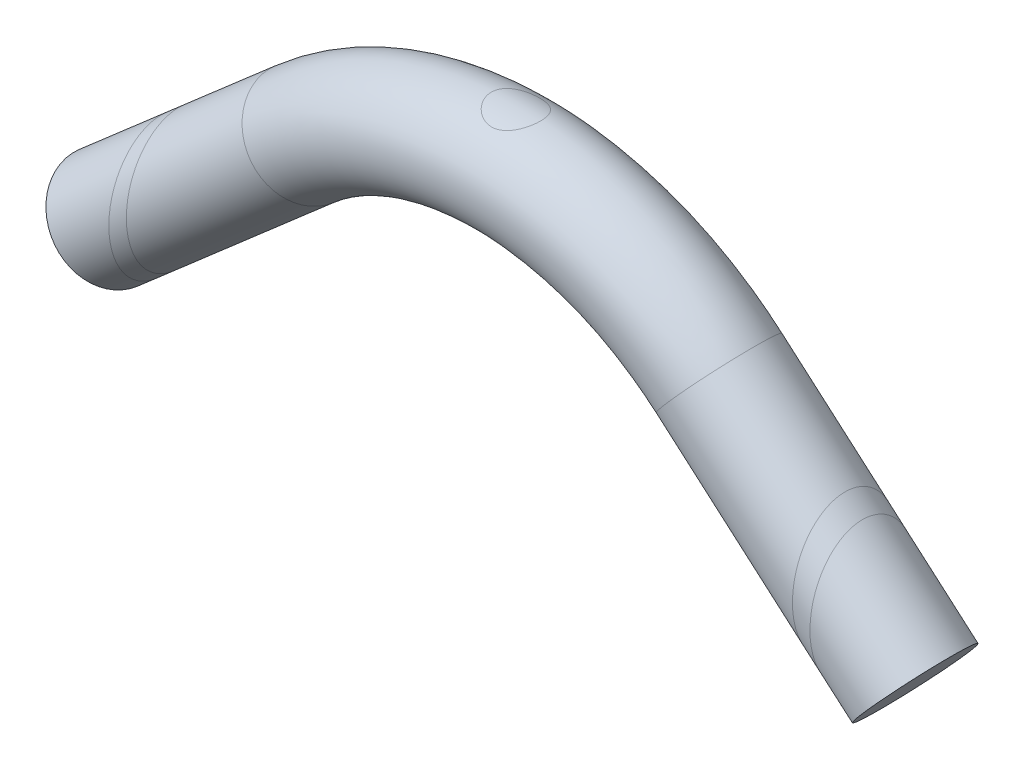
ISO-10303-21;
HEADER;
FILE_DESCRIPTION(('STEP AP214'),'2;1');
FILE_NAME('part.step','',(''),(''),'','','');
FILE_SCHEMA(('AUTOMOTIVE_DESIGN { 1 0 10303 214 1 1 1 1 }'));
ENDSEC;
DATA;
#1=APPLICATION_CONTEXT('core data for automotive mechanical design processes');
#2=APPLICATION_PROTOCOL_DEFINITION('international standard','automotive_design',2000,#1);
#3=PRODUCT_CONTEXT('',#1,'mechanical');
#4=PRODUCT('Part','Part','',(#3));
#5=PRODUCT_RELATED_PRODUCT_CATEGORY('part','',(#4));
#6=PRODUCT_DEFINITION_FORMATION('','',#4);
#7=PRODUCT_DEFINITION_CONTEXT('part definition',#1,'design');
#8=PRODUCT_DEFINITION('design','',#6,#7);
#9=PRODUCT_DEFINITION_SHAPE('','',#8);
#10=(LENGTH_UNIT() NAMED_UNIT(*) SI_UNIT(.MILLI.,.METRE.));
#11=(NAMED_UNIT(*) PLANE_ANGLE_UNIT() SI_UNIT($,.RADIAN.));
#12=(NAMED_UNIT(*) SI_UNIT($,.STERADIAN.) SOLID_ANGLE_UNIT());
#13=UNCERTAINTY_MEASURE_WITH_UNIT(LENGTH_MEASURE(1.E-05),#10,'distance_accuracy_value','');
#14=(GEOMETRIC_REPRESENTATION_CONTEXT(3) GLOBAL_UNCERTAINTY_ASSIGNED_CONTEXT((#13)) GLOBAL_UNIT_ASSIGNED_CONTEXT((#10,
#11,#12)) REPRESENTATION_CONTEXT('',''));
#15=CARTESIAN_POINT('',(0.,0.,0.));
#16=DIRECTION('',(0.,0.,1.));
#17=DIRECTION('',(1.,0.,0.));
#18=AXIS2_PLACEMENT_3D('',#15,#16,#17);
#19=CARTESIAN_POINT('',(174.056084343231,48.6468831797989,0.));
#20=DIRECTION('',(0.754605522163505,-0.656178714924787,0.));
#21=DIRECTION('',(0.656178714924787,0.754605522163505,0.));
#22=AXIS2_PLACEMENT_3D('',#19,#20,#21);
#23=CYLINDRICAL_SURFACE('',#22,15.);
#24=CARTESIAN_POINT('',(174.056084343231,48.6468831797989,0.));
#25=DIRECTION('',(0.754605522163501,-0.656178714924791,0.));
#26=DIRECTION('',(0.,0.,-1.));
#27=AXIS2_PLACEMENT_3D('',#24,#25,#26);
#28=CIRCLE('',#27,15.);
#29=CARTESIAN_POINT('',(174.056084343231,48.6468831797989,-15.));
#30=VERTEX_POINT('',#29);
#31=EDGE_CURVE('E112',#30,#30,#28,.T.);
#32=ORIENTED_EDGE('',*,*,#31,.T.);
#33=EDGE_LOOP('',(#32));
#34=FACE_BOUND('',#33,.T.);
#35=CARTESIAN_POINT('',(210.,17.3913043478261,0.));
#36=DIRECTION('',(1.,0.,0.));
#37=DIRECTION('',(0.,-1.,0.));
#38=AXIS2_PLACEMENT_3D('',#35,#36,#37);
#39=ELLIPSE('',#38,19.8779356358193,15.);
#40=CARTESIAN_POINT('',(210.,-2.48663128799323,0.));
#41=VERTEX_POINT('',#40);
#42=EDGE_CURVE('E10',#41,#41,#39,.F.);
#43=ORIENTED_EDGE('',*,*,#42,.T.);
#44=EDGE_LOOP('',(#43));
#45=FACE_BOUND('',#44,.T.);
#46=ADVANCED_FACE('F34',(#34,#45),#23,.T.);
#47=CARTESIAN_POINT('',(230.,0.,0.));
#48=DIRECTION('',(0.754605522163501,-0.656178714924791,0.));
#49=DIRECTION('',(0.,0.,-1.));
#50=AXIS2_PLACEMENT_3D('',#47,#48,#49);
#51=CIRCLE('',#50,15.);
#52=CARTESIAN_POINT('',(230.,0.,-15.));
#53=VERTEX_POINT('',#52);
#54=EDGE_CURVE('E114',#53,#53,#51,.T.);
#55=ORIENTED_EDGE('',*,*,#54,.F.);
#56=EDGE_LOOP('',(#55));
#57=FACE_BOUND('',#56,.T.);
#58=CARTESIAN_POINT('',(215.,13.0434782608696,0.));
#59=DIRECTION('',(-1.,0.,0.));
#60=DIRECTION('',(0.,-1.,0.));
#61=AXIS2_PLACEMENT_3D('',#58,#59,#60);
#62=ELLIPSE('',#61,19.8779356358194,15.);
#63=CARTESIAN_POINT('',(215.,-6.83445737494978,0.));
#64=VERTEX_POINT('',#63);
#65=EDGE_CURVE('E42',#64,#64,#62,.F.);
#66=ORIENTED_EDGE('',*,*,#65,.T.);
#67=EDGE_LOOP('',(#66));
#68=FACE_BOUND('',#67,.T.);
#69=ADVANCED_FACE('F98',(#57,#68),#23,.T.);
#70=CARTESIAN_POINT('',(55.9439156567688,48.6468831797989,0.));
#71=DIRECTION('',(-0.754605522163505,-0.656178714924787,0.));
#72=DIRECTION('',(0.656178714924787,-0.754605522163505,0.));
#73=AXIS2_PLACEMENT_3D('',#70,#71,#72);
#74=CYLINDRICAL_SURFACE('',#73,15.);
#75=CARTESIAN_POINT('',(20.,17.3913043478261,0.));
#76=DIRECTION('',(1.,0.,0.));
#77=DIRECTION('',(0.,-1.,0.));
#78=AXIS2_PLACEMENT_3D('',#75,#76,#77);
#79=ELLIPSE('',#78,19.8779356358193,15.);
#80=CARTESIAN_POINT('',(20.,-2.48663128799324,0.));
#81=VERTEX_POINT('',#80);
#82=EDGE_CURVE('E56',#81,#81,#79,.T.);
#83=ORIENTED_EDGE('',*,*,#82,.F.);
#84=EDGE_LOOP('',(#83));
#85=FACE_BOUND('',#84,.T.);
#86=CARTESIAN_POINT('',(15.,13.0434782608696,0.));
#87=DIRECTION('',(-1.,0.,0.));
#88=DIRECTION('',(0.,-1.,0.));
#89=AXIS2_PLACEMENT_3D('',#86,#87,#88);
#90=ELLIPSE('',#89,19.8779356358194,15.);
#91=CARTESIAN_POINT('',(15.,-6.83445737494979,0.));
#92=VERTEX_POINT('',#91);
#93=EDGE_CURVE('E49',#92,#92,#90,.T.);
#94=ORIENTED_EDGE('',*,*,#93,.F.);
#95=EDGE_LOOP('',(#94));
#96=FACE_BOUND('',#95,.T.);
#97=ADVANCED_FACE('F88',(#85,#96),#74,.T.);
#98=ORIENTED_EDGE('',*,*,#93,.T.);
#99=EDGE_LOOP('',(#98));
#100=FACE_BOUND('',#99,.T.);
#101=CARTESIAN_POINT('',(0.,0.,0.));
#102=DIRECTION('',(0.7546055221635,0.656178714924792,0.));
#103=DIRECTION('',(0.,0.,-1.));
#104=AXIS2_PLACEMENT_3D('',#101,#102,#103);
#105=CIRCLE('',#104,15.);
#106=CARTESIAN_POINT('',(0.,0.,-15.));
#107=VERTEX_POINT('',#106);
#108=EDGE_CURVE('E70',#107,#107,#105,.T.);
#109=ORIENTED_EDGE('',*,*,#108,.T.);
#110=EDGE_LOOP('',(#109));
#111=FACE_BOUND('',#110,.T.);
#112=ADVANCED_FACE('F89',(#100,#111),#74,.T.);
#113=CARTESIAN_POINT('',(115.,-19.2676138149161,0.));
#114=DIRECTION('',(0.,0.,-1.));
#115=DIRECTION('',(-1.,0.,0.));
#116=AXIS2_PLACEMENT_3D('',#113,#114,#115);
#117=TOROIDAL_SURFACE('',#116,90.,15.);
#118=CARTESIAN_POINT('',(110.588080153037,85.0106860922542,-4.2962066277505));
#119=CARTESIAN_POINT('',(110.710333370802,84.9688042737843,-4.4534690690307));
#120=CARTESIAN_POINT('',(110.839197371035,84.9257780592193,-4.60537547301822));
#121=CARTESIAN_POINT('',(111.1092662584,84.8385685155191,-4.89755901823602));
#122=CARTESIAN_POINT('',(111.250478951075,84.7943844670604,-5.03782869320342));
#123=CARTESIAN_POINT('',(111.544722648569,84.7059378756666,-5.30620513999618));
#124=CARTESIAN_POINT('',(111.697783390272,84.6616754268374,-5.43427938207064));
#125=CARTESIAN_POINT('',(112.014505516151,84.5744150263256,-5.67705037735854));
#126=CARTESIAN_POINT('',(112.1781667711,84.5314170592374,-5.7917472936023));
#127=CARTESIAN_POINT('',(112.515366098727,84.4478828490656,-6.00711752303018));
#128=CARTESIAN_POINT('',(112.688915873195,84.4073496450391,-6.10777371412001));
#129=CARTESIAN_POINT('',(113.044595434889,84.3300760783223,-6.29406440857466));
#130=CARTESIAN_POINT('',(113.226720619008,84.2933337138385,-6.37970685698598));
#131=CARTESIAN_POINT('',(113.598324847087,84.2248607838035,-6.53519724918478));
#132=CARTESIAN_POINT('',(113.787797448337,84.1931259458068,-6.60505867961943));
#133=CARTESIAN_POINT('',(114.172914955624,84.1357511855118,-6.72834766548335));
#134=CARTESIAN_POINT('',(114.36855940978,84.1101108181647,-6.78177642099294));
#135=CARTESIAN_POINT('',(114.755652334536,84.0668680557006,-6.8695575852939));
#136=CARTESIAN_POINT('',(114.946897046943,84.0489574207315,-6.90465638501284));
#137=CARTESIAN_POINT('',(115.332170430975,84.020196550908,-6.95885151039911));
#138=CARTESIAN_POINT('',(115.526199023221,84.0093461151455,-6.97794829143142));
#139=CARTESIAN_POINT('',(115.915391274496,83.9950818814304,-6.99987763591605));
#140=CARTESIAN_POINT('',(116.110554591912,83.9916659508422,-7.00271486390702));
#141=CARTESIAN_POINT('',(116.500417542304,83.9923464117247,-6.99207973530268));
#142=CARTESIAN_POINT('',(116.695117197268,83.9964424395744,-6.97860816815513));
#143=CARTESIAN_POINT('',(117.067728790116,84.0113360326328,-6.93714730416917));
#144=CARTESIAN_POINT('',(117.245794709894,84.0216021716241,-6.91033566265612));
#145=CARTESIAN_POINT('',(117.598975783804,84.0479765892532,-6.84317181756936));
#146=CARTESIAN_POINT('',(117.774089902676,84.0640868747138,-6.80281496305834));
#147=CARTESIAN_POINT('',(118.120129153532,84.1015870161339,-6.70895336512736));
#148=CARTESIAN_POINT('',(118.291055192349,84.1229757178679,-6.65545149612454));
#149=CARTESIAN_POINT('',(118.627805073403,84.1703534045374,-6.53573510631109));
#150=CARTESIAN_POINT('',(118.793626917288,84.1963441650056,-6.46951567806704));
#151=CARTESIAN_POINT('',(119.123873754301,84.2529417584928,-6.3228119698531));
#152=CARTESIAN_POINT('',(119.28812184553,84.2836597292608,-6.24197261588938));
#153=CARTESIAN_POINT('',(119.609366823573,84.3482341430492,-6.06795742131536));
#154=CARTESIAN_POINT('',(119.766361229131,84.3820916482703,-5.97477740088003));
#155=CARTESIAN_POINT('',(120.072280573781,84.4520067227481,-5.7766867816381));
#156=CARTESIAN_POINT('',(120.221204277575,84.4880646270118,-5.67177439456514));
#157=CARTESIAN_POINT('',(120.510238709914,84.5614402896209,-5.4508349929985));
#158=CARTESIAN_POINT('',(120.65034900969,84.5987581091255,-5.33480743844589));
#159=CARTESIAN_POINT('',(120.9322498906,84.6768284482927,-5.08223563876463));
#160=CARTESIAN_POINT('',(121.073224772209,84.7176102477644,-4.94478843472622));
#161=CARTESIAN_POINT('',(121.343156686449,84.798425291416,-4.65844140575154));
#162=CARTESIAN_POINT('',(121.472117314919,84.8384587566846,-4.50954503203698));
#163=CARTESIAN_POINT('',(121.71730888673,84.9167306671187,-4.20103378765223));
#164=CARTESIAN_POINT('',(121.833533091867,84.9549681560692,-4.04141331474065));
#165=CARTESIAN_POINT('',(122.052303357531,85.0285885811069,-3.71252862345495));
#166=CARTESIAN_POINT('',(122.154855044328,85.0639726889834,-3.54326841303101));
#167=CARTESIAN_POINT('',(122.346717327223,85.1313755875043,-3.19392038639429));
#168=CARTESIAN_POINT('',(122.435847230271,85.1633470099221,-3.01372402498222));
#169=CARTESIAN_POINT('',(122.598482421903,85.2225141655747,-2.64573895426173));
#170=CARTESIAN_POINT('',(122.671994054538,85.2497118370958,-2.45795336468779));
#171=CARTESIAN_POINT('',(122.802698746245,85.2985764546699,-2.07611951544548));
#172=CARTESIAN_POINT('',(122.859894848006,85.320244431878,-1.88207243100892));
#173=CARTESIAN_POINT('',(122.957367681183,85.3574319659421,-1.48919977748589));
#174=CARTESIAN_POINT('',(122.997645533564,85.3729519301478,-1.29037452591319));
#175=CARTESIAN_POINT('',(123.058913869096,85.3966527345453,-0.901706109966652));
#176=CARTESIAN_POINT('',(123.080923122626,85.4052205239438,-0.712046559922282));
#177=CARTESIAN_POINT('',(123.109372290643,85.4163072653736,-0.331389929648165));
#178=CARTESIAN_POINT('',(123.115812867672,85.4188264748088,-0.140392906682985));
#179=CARTESIAN_POINT('',(123.113056349095,85.4177499653922,0.241433878820464));
#180=CARTESIAN_POINT('',(123.10386215487,85.4141553810918,0.432263665818315));
#181=CARTESIAN_POINT('',(123.069940492403,85.4009480141408,0.81232491651545));
#182=CARTESIAN_POINT('',(123.045213214133,85.391335305093,1.00155639973363));
#183=CARTESIAN_POINT('',(122.981706914586,85.3668148227675,1.36992080717891));
#184=CARTESIAN_POINT('',(122.943492144028,85.3521200920466,1.54916566283535));
#185=CARTESIAN_POINT('',(122.853261599904,85.3177364835023,1.90371771504092));
#186=CARTESIAN_POINT('',(122.801241289798,85.2980459641415,2.07902359665502));
#187=CARTESIAN_POINT('',(122.683878514959,85.2541417479619,2.42447362828106));
#188=CARTESIAN_POINT('',(122.618539718023,85.2299292965981,2.59461918461446));
#189=CARTESIAN_POINT('',(122.475036647971,85.1775264790299,2.92884814521632));
#190=CARTESIAN_POINT('',(122.396867503848,85.1493346026189,3.09292921802148));
#191=CARTESIAN_POINT('',(122.225485014265,85.0886207978344,3.41941645051938));
#192=CARTESIAN_POINT('',(122.131856266044,85.0559856633698,3.58158346009102));
#193=CARTESIAN_POINT('',(121.932185885003,84.9879273628851,3.89754163667667));
#194=CARTESIAN_POINT('',(121.826139987575,84.9525032403774,4.05132989932328));
#195=CARTESIAN_POINT('',(121.602331203223,84.8797145505011,4.34968686838114));
#196=CARTESIAN_POINT('',(121.484566014176,84.8423496025711,4.49425375416813));
#197=CARTESIAN_POINT('',(121.238034147643,84.7665831011805,4.77339229034065));
#198=CARTESIAN_POINT('',(121.109267040012,84.7281815072299,4.90796354953866));
#199=CARTESIAN_POINT('',(120.83296549764,84.6488510823205,5.17458545109663));
#200=CARTESIAN_POINT('',(120.68475926227,84.6079159453474,5.30593902725085));
#201=CARTESIAN_POINT('',(120.377627606019,84.5271266400189,5.55570944600869));
#202=CARTESIAN_POINT('',(120.218705653631,84.4872721276848,5.67413044246271));
#203=CARTESIAN_POINT('',(119.89091851249,84.4098115802084,5.89736247324602));
#204=CARTESIAN_POINT('',(119.722048040828,84.3722067614634,6.00216618003143));
#205=CARTESIAN_POINT('',(119.375507637768,84.3004965381697,6.19726639330381));
#206=CARTESIAN_POINT('',(119.197841599385,84.2663896055912,6.28756924423712));
#207=CARTESIAN_POINT('',(118.834269568391,84.2027551109962,6.45317700387719));
#208=CARTESIAN_POINT('',(118.648343103257,84.1732398484052,6.5284417791101));
#209=CARTESIAN_POINT('',(118.270045462923,84.1200229119304,6.6629125089341));
#210=CARTESIAN_POINT('',(118.077677190635,84.0963186584229,6.72212559043436));
#211=CARTESIAN_POINT('',(117.687969778928,84.0556852747822,6.82386208781551));
#212=CARTESIAN_POINT('',(117.490633156485,84.0387527846583,6.86639378040877));
#213=CARTESIAN_POINT('',(117.092538078232,84.01239764525,6.93429383785227));
#214=CARTESIAN_POINT('',(116.891779933409,84.0029743171255,6.95966375412261));
#215=CARTESIAN_POINT('',(116.504768948846,83.9925301845096,6.99159556826833));
#216=CARTESIAN_POINT('',(116.318642233454,83.990896824193,6.99950115884557));
#217=CARTESIAN_POINT('',(115.94641886261,83.9944771481832,7.00045299850533));
#218=CARTESIAN_POINT('',(115.760322206343,83.9996905959763,6.99349976086059));
#219=CARTESIAN_POINT('',(115.389592400176,84.0168226221296,6.96483359219984));
#220=CARTESIAN_POINT('',(115.204959200379,84.0287409708789,6.94312116661015));
#221=CARTESIAN_POINT('',(114.838509730042,84.0589036105019,6.88519875181672));
#222=CARTESIAN_POINT('',(114.656693478643,84.0771479443441,6.84898866413869));
#223=CARTESIAN_POINT('',(114.3028996378,84.1187028280134,6.76385396128808));
#224=CARTESIAN_POINT('',(114.130793423706,84.1418324635609,6.7153735630145));
#225=CARTESIAN_POINT('',(113.791370715898,84.1928110794241,6.60563055134465));
#226=CARTESIAN_POINT('',(113.624055802481,84.2206615963224,6.54436377465014));
#227=CARTESIAN_POINT('',(113.295192422658,84.2803103376349,6.40955658898653));
#228=CARTESIAN_POINT('',(113.133643359528,84.3121081519977,6.3360174546161));
#229=CARTESIAN_POINT('',(112.817077814765,84.3788300563019,6.17718672134496));
#230=CARTESIAN_POINT('',(112.66206372923,84.4137552785163,6.09189085986355));
#231=CARTESIAN_POINT('',(112.185889551197,84.527199870655,5.80590071543633));
#232=CARTESIAN_POINT('',(111.877636388994,84.6098627364902,5.58486502024433));
#233=CARTESIAN_POINT('',(111.300992664287,84.7771921779112,5.09626568169539));
#234=CARTESIAN_POINT('',(111.032618901987,84.8618595806439,4.82868253150557));
#235=CARTESIAN_POINT('',(110.656758959061,84.9868457062657,4.38774965636404));
#236=CARTESIAN_POINT('',(110.532732668831,85.0293850870082,4.22886253040263));
#237=CARTESIAN_POINT('',(110.298553181085,85.1116147768516,3.90051516276549));
#238=CARTESIAN_POINT('',(110.188394688551,85.1513061708697,3.73105899375852));
#239=CARTESIAN_POINT('',(109.982792722496,85.2267917595245,3.38255586542018));
#240=CARTESIAN_POINT('',(109.887353326724,85.2625848733857,3.20350626679009));
#241=CARTESIAN_POINT('',(109.712122653994,85.3292764202803,2.83712420281949));
#242=CARTESIAN_POINT('',(109.632323913399,85.3601771865553,2.64979574066493));
#243=CARTESIAN_POINT('',(109.491432438313,85.4153422487658,2.27427805383052));
#244=CARTESIAN_POINT('',(109.429820553541,85.4397880476273,2.08631035208692));
#245=CARTESIAN_POINT('',(109.322620925367,85.4826476401047,1.70526817229623));
#246=CARTESIAN_POINT('',(109.277026147471,85.5010640814895,1.51219597623475));
#247=CARTESIAN_POINT('',(109.202346170299,85.531371267952,1.12244027245747));
#248=CARTESIAN_POINT('',(109.173255718276,85.5432640892284,0.925757934319541));
#249=CARTESIAN_POINT('',(109.131906519475,85.5602014132011,0.53034304298823));
#250=CARTESIAN_POINT('',(109.119646770423,85.5652463236921,0.331610612588547));
#251=CARTESIAN_POINT('',(109.112361814033,85.5682422788509,-0.0525573048315527));
#252=CARTESIAN_POINT('',(109.116211079731,85.5666566049037,-0.237968898069775));
#253=CARTESIAN_POINT('',(109.138590540779,85.5574650745516,-0.607752204338709));
#254=CARTESIAN_POINT('',(109.157120438002,85.5498593403987,-0.792123938409721));
#255=CARTESIAN_POINT('',(109.208680654315,85.5288071406463,-1.15857657709778));
#256=CARTESIAN_POINT('',(109.241717935168,85.5153578709,-1.3406563386441));
#257=CARTESIAN_POINT('',(109.321961668142,85.4829410774606,-1.70115684484258));
#258=CARTESIAN_POINT('',(109.369167841579,85.4639736623023,-1.87957766138766));
#259=CARTESIAN_POINT('',(109.476837752284,85.4211512839357,-2.23007003319368));
#260=CARTESIAN_POINT('',(109.537184642564,85.397339512107,-2.40218284193045));
#261=CARTESIAN_POINT('',(109.670873923034,85.345256981579,-2.74067575201019));
#262=CARTESIAN_POINT('',(109.744222242161,85.3169841892056,-2.9070531963787));
#263=CARTESIAN_POINT('',(109.903134541232,85.2566806089604,-3.23268376002478));
#264=CARTESIAN_POINT('',(109.988671643189,85.2246581166929,-3.3919515682039));
#265=CARTESIAN_POINT('',(110.171469688416,85.157496779529,-3.70290615147262));
#266=CARTESIAN_POINT('',(110.268728505616,85.1223585000749,-3.85459429431335));
#267=CARTESIAN_POINT('',(110.406347255765,85.0737364254853,-4.05208266311589));
#268=CARTESIAN_POINT('',(110.441822844075,85.0612916986711,-4.10159895159401));
#269=CARTESIAN_POINT('',(110.514020189777,85.0361622485383,-4.1996455192194));
#270=CARTESIAN_POINT('',(110.550741844408,85.0234775450483,-4.248175879149));
#271=CARTESIAN_POINT('',(110.588080153037,85.0106860922542,-4.2962066277505));
#272=B_SPLINE_CURVE_WITH_KNOTS('',3,(#118,#119,#120,#121,#122,#123,#124,#125,#126,#127,#128,
#129,#130,#131,#132,#133,#134,#135,#136,#137,#138,#139,#140,#141,#142,#143,#144,#145,#146,#147,
#148,#149,#150,#151,#152,#153,#154,#155,#156,#157,#158,#159,#160,#161,#162,#163,#164,#165,#166,
#167,#168,#169,#170,#171,#172,#173,#174,#175,#176,#177,#178,#179,#180,#181,#182,#183,#184,#185,
#186,#187,#188,#189,#190,#191,#192,#193,#194,#195,#196,#197,#198,#199,#200,#201,#202,#203,#204,
#205,#206,#207,#208,#209,#210,#211,#212,#213,#214,#215,#216,#217,#218,#219,#220,#221,#222,#223,
#224,#225,#226,#227,#228,#229,#230,#231,#232,#233,#234,#235,#236,#237,#238,#239,#240,#241,#242,
#243,#244,#245,#246,#247,#248,#249,#250,#251,#252,#253,#254,#255,#256,#257,#258,#259,#260,#261,
#262,#263,#264,#265,#266,#267,#268,#269,#270,#271),.UNSPECIFIED.,.T.,.F.,(4,2,2,2,2,2,2,2,2,2,2,
2,2,2,2,2,2,2,2,2,2,2,2,2,2,2,2,2,2,2,2,2,2,2,2,2,2,2,2,2,2,2,2,2,2,2,2,2,2,2,2,2,2,2,2,2,2,2,2,
2,2,2,2,2,2,2,2,2,2,2,2,2,2,2,2,2,4),(0.,0.610583154258999,1.22155508387627,1.83411354908098,
2.44666454821633,3.05995611756356,3.67292215608763,4.28536234774131,4.89775780218489,
5.4827606047,6.06774675938806,6.65256508491316,7.23735510270296,7.77782479478306,
8.31848025482477,8.85901759492557,9.39976393741608,9.9560409169922,10.5125067936111,
11.0690576035641,11.6256354686938,12.2281490998513,12.8304818168144,13.433131674907,
14.0355327707213,14.6454316891759,15.2550823945687,15.8646193315388,16.4741158755875,
17.0467669865314,17.6193937272455,18.1919142158294,18.7644277025078,19.3153806197387,
19.8665148063945,20.4174974199651,20.9686896985028,21.5382990279597,22.1081045639122,
22.678022253517,23.2479622356057,23.8539298161883,24.4597021883869,25.0657991920599,
25.6716302880339,26.2790572361728,26.8862140449935,27.49306922193,28.0998695319825,
28.6580674392732,29.216246064887,29.7744055767147,30.3325688798632,30.8728608248962,
31.4133289664783,31.9537410103037,32.4943495066914,33.6537163615298,34.8135702526524,
35.4309340716962,36.0480614485684,36.6653594871847,37.2823622334899,37.879517706626,
38.4764105883977,39.0731133934439,39.6697806631347,40.2254808277781,40.7811697078659,
41.3371255422854,41.8930704425,42.4442602774599,42.9957021167478,43.5459462444301,
44.0960907192746,44.2825890249726,44.4690719877435),.UNSPECIFIED.);
#273=CARTESIAN_POINT('',(110.588080153037,85.0106860922542,-4.2962066277505));
#274=VERTEX_POINT('',#273);
#275=EDGE_CURVE('E63',#274,#274,#272,.T.);
#276=ORIENTED_EDGE('',*,*,#275,.T.);
#277=EDGE_LOOP('',(#276));
#278=FACE_BOUND('',#277,.T.);
#279=CARTESIAN_POINT('',(55.9439156567688,48.6468831797989,0.));
#280=DIRECTION('',(0.7546055221635,0.656178714924792,0.));
#281=DIRECTION('',(0.,0.,-1.));
#282=AXIS2_PLACEMENT_3D('',#279,#280,#281);
#283=CIRCLE('',#282,15.);
#284=CARTESIAN_POINT('',(55.9439156567688,48.6468831797989,-15.));
#285=VERTEX_POINT('',#284);
#286=EDGE_CURVE('E116',#285,#285,#283,.T.);
#287=ORIENTED_EDGE('',*,*,#286,.T.);
#288=EDGE_LOOP('',(#287));
#289=FACE_BOUND('',#288,.T.);
#290=ORIENTED_EDGE('',*,*,#31,.F.);
#291=EDGE_LOOP('',(#290));
#292=FACE_BOUND('',#291,.T.);
#293=CARTESIAN_POINT('',(109.933391254338,55.9260523832273,-3.28518633884096));
#294=CARTESIAN_POINT('',(109.850554926002,55.885405402096,-3.12933368514236));
#295=CARTESIAN_POINT('',(109.773418214975,55.8468356871537,-2.96996870099587));
#296=CARTESIAN_POINT('',(109.631107156614,55.7747094830647,-2.64490910331585));
#297=CARTESIAN_POINT('',(109.565928902859,55.7411513574717,-2.47921657821852));
#298=CARTESIAN_POINT('',(109.448105513525,55.6798497887927,-2.14230960341092));
#299=CARTESIAN_POINT('',(109.395465288062,55.6521086242396,-1.97109302008707));
#300=CARTESIAN_POINT('',(109.30331881756,55.6031764525475,-1.62431099541703));
#301=CARTESIAN_POINT('',(109.26380711382,55.5819827233118,-1.44874739422411));
#302=CARTESIAN_POINT('',(109.19823362242,55.5466375365953,-1.09376995621378));
#303=CARTESIAN_POINT('',(109.172219974742,55.5325112911819,-0.914344683553706));
#304=CARTESIAN_POINT('',(109.134183667741,55.5118103120392,-0.553578792316565));
#305=CARTESIAN_POINT('',(109.122161095748,55.5052356254452,-0.372238161791371));
#306=CARTESIAN_POINT('',(109.112266917108,55.4998269696694,-0.0090883409304081));
#307=CARTESIAN_POINT('',(109.114392727907,55.5009915878048,0.172720757838162));
#308=CARTESIAN_POINT('',(109.132761240932,55.5110249627403,0.535405302012874));
#309=CARTESIAN_POINT('',(109.149003552284,55.5198935062252,0.716280773130885));
#310=CARTESIAN_POINT('',(109.194351999909,55.5445161565612,1.06766132226524));
#311=CARTESIAN_POINT('',(109.222850207741,55.5599445108563,1.23826836408292));
#312=CARTESIAN_POINT('',(109.292221302295,55.5972131994188,1.57629228208433));
#313=CARTESIAN_POINT('',(109.333098528034,55.6190557818796,1.74370801776504));
#314=CARTESIAN_POINT('',(109.42678661095,55.6686122825542,2.07422933291182));
#315=CARTESIAN_POINT('',(109.479595019406,55.6963249959263,2.23733578914069));
#316=CARTESIAN_POINT('',(109.596671972321,55.7569884247127,2.55843976175653));
#317=CARTESIAN_POINT('',(109.660945005777,55.7899411913306,2.71643524820182));
#318=CARTESIAN_POINT('',(109.803620201269,55.8619713090125,3.03363393056508));
#319=CARTESIAN_POINT('',(109.882536653307,55.9012607953367,3.19255779146102));
#320=CARTESIAN_POINT('',(110.051700006,55.9838618087907,3.50319043985705));
#321=CARTESIAN_POINT('',(110.141950753704,56.0271747002257,3.65489675338061));
#322=CARTESIAN_POINT('',(110.428795725838,56.1617269021387,4.09820480372602));
#323=CARTESIAN_POINT('',(110.64154113551,56.2576102479595,4.37812457475948));
#324=CARTESIAN_POINT('',(111.132614892154,56.4651011084693,4.93278331210469));
#325=CARTESIAN_POINT('',(111.415692452066,56.5772406818364,5.20313606118373));
#326=CARTESIAN_POINT('',(111.871962982569,56.7405613396114,5.5711918797224));
#327=CARTESIAN_POINT('',(112.029453625249,56.794223630953,5.68770192899172));
#328=CARTESIAN_POINT('',(112.354438310901,56.8984238727423,5.90758204454914));
#329=CARTESIAN_POINT('',(112.521933809658,56.9489613663194,6.01095019170785));
#330=CARTESIAN_POINT('',(112.872765134174,57.0472016072538,6.20744543682728));
#331=CARTESIAN_POINT('',(113.056463404467,57.094718298911,6.30001960434356));
#332=CARTESIAN_POINT('',(113.432595008502,57.1829107833407,6.46909885026798));
#333=CARTESIAN_POINT('',(113.625023697788,57.2235901605098,6.54561235359402));
#334=CARTESIAN_POINT('',(114.017158909609,57.2964360908466,6.68159298468269));
#335=CARTESIAN_POINT('',(114.216857429527,57.3286117007114,6.74107825354513));
#336=CARTESIAN_POINT('',(114.622039304866,57.3830352709583,6.84220611840026));
#337=CARTESIAN_POINT('',(114.827521555294,57.4052851141753,6.88385209829713));
#338=CARTESIAN_POINT('',(115.217354273426,57.4367328354587,6.94471296377342));
#339=CARTESIAN_POINT('',(115.401279904485,57.4471770181733,6.96602063091498));
#340=CARTESIAN_POINT('',(115.770527922844,57.4590600727176,6.99398833156427));
#341=CARTESIAN_POINT('',(115.955850188481,57.460499720072,7.00064962647377));
#342=CARTESIAN_POINT('',(116.326238840949,57.4542531481262,6.99925059921114));
#343=CARTESIAN_POINT('',(116.51130527646,57.4465690080589,6.99119363097977));
#344=CARTESIAN_POINT('',(116.87963072235,57.4223125797845,6.96052483273872));
#345=CARTESIAN_POINT('',(117.062889778305,57.4057405162938,6.93791337071249));
#346=CARTESIAN_POINT('',(117.40965439089,57.3661480958896,6.88119790964346));
#347=CARTESIAN_POINT('',(117.573445024415,57.3438482182855,6.84832112421899));
#348=CARTESIAN_POINT('',(117.897363384952,57.2929767158562,6.77123078919048));
#349=CARTESIAN_POINT('',(118.057489883964,57.2644030214518,6.72701349781942));
#350=CARTESIAN_POINT('',(118.530994857264,57.1703626694853,6.5780281926156));
#351=CARTESIAN_POINT('',(118.837722535086,57.09654962527,6.45688942380725));
#352=CARTESIAN_POINT('',(119.453484947097,56.9264219260193,6.16267158573632));
#353=CARTESIAN_POINT('',(119.760383871534,56.8287055144302,5.98598162919719));
#354=CARTESIAN_POINT('',(120.342251891883,56.6241435787289,5.59026743280804));
#355=CARTESIAN_POINT('',(120.617198539697,56.5172917268931,5.37121371468464));
#356=CARTESIAN_POINT('',(121.167239162233,56.2882922273435,4.86110788289713));
#357=CARTESIAN_POINT('',(121.43702584735,56.1660858830036,4.56427808080865));
#358=CARTESIAN_POINT('',(121.801980342056,55.9919702789259,4.08586020586252));
#359=CARTESIAN_POINT('',(121.917064358628,55.9354349059724,3.92075668106545));
#360=CARTESIAN_POINT('',(122.13321618802,55.8268803090733,3.58010025112732));
#361=CARTESIAN_POINT('',(122.234282544038,55.7748615547321,3.40454626261528));
#362=CARTESIAN_POINT('',(122.421895924091,55.6765783148253,3.04301517466002));
#363=CARTESIAN_POINT('',(122.508361124457,55.6303466102296,2.85698665186399));
#364=CARTESIAN_POINT('',(122.665069104737,55.5454021615802,2.47665936449795));
#365=CARTESIAN_POINT('',(122.735320574381,55.5066853916834,2.28236509638579));
#366=CARTESIAN_POINT('',(122.858640280988,55.4380433076997,1.88705594256089));
#367=CARTESIAN_POINT('',(122.911722904177,55.4081106351473,1.68604684003719));
#368=CARTESIAN_POINT('',(122.999939992876,55.3580485298426,1.27893799404978));
#369=CARTESIAN_POINT('',(123.035077441398,55.337917467803,1.07283910263248));
#370=CARTESIAN_POINT('',(123.083559449586,55.3100574165093,0.6836250629273));
#371=CARTESIAN_POINT('',(123.099083380232,55.3010902899938,0.500866668580504));
#372=CARTESIAN_POINT('',(123.115726245529,55.2914748283552,0.134483551658487));
#373=CARTESIAN_POINT('',(123.116846513387,55.2908257233135,-0.0491410891627479));
#374=CARTESIAN_POINT('',(123.104667771456,55.2978648883821,-0.415711481983137));
#375=CARTESIAN_POINT('',(123.091371530919,55.3055515572819,-0.598657357593258));
#376=CARTESIAN_POINT('',(123.050555450501,55.329033282948,-0.962422240880587));
#377=CARTESIAN_POINT('',(123.02303577438,55.3448282463599,-1.1432412730206));
#378=CARTESIAN_POINT('',(122.956437622442,55.3827706767016,-1.48944929056385));
#379=CARTESIAN_POINT('',(122.918249851723,55.4044256606709,-1.65506455105893));
#380=CARTESIAN_POINT('',(122.830226858101,55.4538864994621,-1.98225207137916));
#381=CARTESIAN_POINT('',(122.780387711522,55.4816944261584,-2.14382294889529));
#382=CARTESIAN_POINT('',(122.614127547524,55.5734192797068,-2.62099858332312));
#383=CARTESIAN_POINT('',(122.480912754841,55.6456673729504,-2.92932741235546));
#384=CARTESIAN_POINT('',(122.16266660692,55.8123722420983,-3.54250955652881));
#385=CARTESIAN_POINT('',(121.974502494707,55.90808679013,-3.84537433507285));
#386=CARTESIAN_POINT('',(121.556607650105,56.1100774462298,-4.41704614376227));
#387=CARTESIAN_POINT('',(121.326848961755,56.2163606357573,-4.68583006009616));
#388=CARTESIAN_POINT('',(120.798507260962,56.4445796243657,-5.21713390179304));
#389=CARTESIAN_POINT('',(120.494899909488,56.5668001748412,-5.47459651661765));
#390=CARTESIAN_POINT('',(120.008454041581,56.7424748965096,-5.82045871173079));
#391=CARTESIAN_POINT('',(119.841013179374,56.7997921198351,-5.92908201304899));
#392=CARTESIAN_POINT('',(119.496356476464,56.9102842175264,-6.13219508328189));
#393=CARTESIAN_POINT('',(119.319139388101,56.9634585610718,-6.22668304248023));
#394=CARTESIAN_POINT('',(118.952475130866,57.064925459351,-6.40223813799449));
#395=CARTESIAN_POINT('',(118.762861161382,57.1131080452517,-6.48302105405458));
#396=CARTESIAN_POINT('',(118.375727676036,57.2016966608196,-6.62797561002581));
#397=CARTESIAN_POINT('',(118.178212656977,57.242107039984,-6.69215654774554));
#398=CARTESIAN_POINT('',(117.77690577097,57.3135602503606,-6.80294567859223));
#399=CARTESIAN_POINT('',(117.573121790693,57.3446143605783,-6.84957504723146));
#400=CARTESIAN_POINT('',(117.160904345527,57.3961027948979,-6.9245316590524));
#401=CARTESIAN_POINT('',(116.952471831291,57.4165392699745,-6.95286260950414));
#402=CARTESIAN_POINT('',(116.561845560042,57.4438989940701,-6.98806225899943));
#403=CARTESIAN_POINT('',(116.379967406503,57.4522895323224,-6.99733876296101));
#404=CARTESIAN_POINT('',(116.01585647301,57.4602593432555,-7.00167005053253));
#405=CARTESIAN_POINT('',(115.833623730097,57.4598394915904,-6.99672624752428));
#406=CARTESIAN_POINT('',(115.470348595596,57.4502660965152,-6.97266497515801));
#407=CARTESIAN_POINT('',(115.289306113148,57.4411132277279,-6.95354860065233));
#408=CARTESIAN_POINT('',(114.929866608705,57.4144750371725,-6.90140193361878));
#409=CARTESIAN_POINT('',(114.751469576131,57.3969897487358,-6.86837169674943));
#410=CARTESIAN_POINT('',(114.411640642494,57.3559320326195,-6.79175506002751));
#411=CARTESIAN_POINT('',(114.249926300815,57.332902170955,-6.74912422432795));
#412=CARTESIAN_POINT('',(113.93079648891,57.2809746753626,-6.65272483869331));
#413=CARTESIAN_POINT('',(113.77338247632,57.2520750791556,-6.59895256400287));
#414=CARTESIAN_POINT('',(113.308815261268,57.1577552359955,-6.4216209738825));
#415=CARTESIAN_POINT('',(113.009179568954,57.084693666089,-6.28201092957208));
#416=CARTESIAN_POINT('',(112.405896631726,56.9171793623188,-5.94780617660471));
#417=CARTESIAN_POINT('',(112.104980421529,56.821302289469,-5.74904499726975));
#418=CARTESIAN_POINT('',(111.538416910951,56.6230240025249,-5.30913801368193));
#419=CARTESIAN_POINT('',(111.272766657692,56.520623335726,-5.06799576200192));
#420=CARTESIAN_POINT('',(110.81267729311,56.3314986881857,-4.58113048321395));
#421=CARTESIAN_POINT('',(110.613472825172,56.2444556876619,-4.34000639245879));
#422=CARTESIAN_POINT('',(110.247901594051,56.0780784940398,-3.83139325801679));
#423=CARTESIAN_POINT('',(110.08153211521,55.9987436637032,-3.56390639744275));
#424=CARTESIAN_POINT('',(109.933391254338,55.9260523832273,-3.28518633884096));
#425=B_SPLINE_CURVE_WITH_KNOTS('',3,(#293,#294,#295,#296,#297,#298,#299,#300,#301,#302,#303,
#304,#305,#306,#307,#308,#309,#310,#311,#312,#313,#314,#315,#316,#317,#318,#319,#320,#321,#322,
#323,#324,#325,#326,#327,#328,#329,#330,#331,#332,#333,#334,#335,#336,#337,#338,#339,#340,#341,
#342,#343,#344,#345,#346,#347,#348,#349,#350,#351,#352,#353,#354,#355,#356,#357,#358,#359,#360,
#361,#362,#363,#364,#365,#366,#367,#368,#369,#370,#371,#372,#373,#374,#375,#376,#377,#378,#379,
#380,#381,#382,#383,#384,#385,#386,#387,#388,#389,#390,#391,#392,#393,#394,#395,#396,#397,#398,
#399,#400,#401,#402,#403,#404,#405,#406,#407,#408,#409,#410,#411,#412,#413,#414,#415,#416,#417,
#418,#419,#420,#421,#422,#423,#424),.UNSPECIFIED.,.T.,.F.,(4,2,2,2,2,2,2,2,2,2,2,2,2,2,2,2,2,2,
2,2,2,2,2,2,2,2,2,2,2,2,2,2,2,2,2,2,2,2,2,2,2,2,2,2,2,2,2,2,2,2,2,2,2,2,2,2,2,2,2,2,2,2,2,2,2,
4),(0.,0.543124865260171,1.08607199306228,1.62923140033289,2.17216468419189,2.7170212226301,
3.26188116192831,3.80664164874186,4.35138705207688,4.87176476164114,5.39232508226518,
5.91277866146226,6.43343647448725,6.97806685003175,7.52288258434156,8.61208418065553,
9.82792244238956,10.4367184912157,11.045603341468,11.6781116966883,12.3102874241903,
12.9417871326304,13.5731669998688,14.1287430781859,14.6842713062849,15.2396729585555,
15.7950605690746,16.3001162847317,16.8053388569201,17.8151062950591,18.913017665634,
20.0116957703631,21.2633135386563,21.8898263782065,22.5164042801188,23.1463846510256,
23.7760265965397,24.4051395734663,25.0341479394224,25.5843230008326,26.1344471374947,
26.6844656200733,27.2344777701782,27.7479016072992,28.2614985929476,29.2878984956678,
30.3911445954324,31.4951349650268,32.7382405666514,33.3606085361359,33.9830561179399,
34.6171511556078,35.2508903006575,35.8838623863416,36.5167061912572,37.0628864184232,
37.6090123616326,38.1550961201917,38.7011776943159,39.2070780394377,39.7131477885562,
40.7248046157683,41.8400535100971,42.9552089637769,43.9265900537336,44.8978907706669),.UNSPECIFIED.);
#426=CARTESIAN_POINT('',(109.933391254338,55.9260523832273,-3.28518633884096));
#427=VERTEX_POINT('',#426);
#428=EDGE_CURVE('E62',#427,#427,#425,.T.);
#429=ORIENTED_EDGE('',*,*,#428,.T.);
#430=EDGE_LOOP('',(#429));
#431=FACE_BOUND('',#430,.T.);
#432=ADVANCED_FACE('F83',(#278,#289,#292,#431),#117,.T.);
#433=ORIENTED_EDGE('',*,*,#428,.F.);
#434=EDGE_LOOP('',(#433));
#435=FACE_BOUND('',#434,.T.);
#436=ADVANCED_FACE('F82',(#435),#117,.T.);
#437=ORIENTED_EDGE('',*,*,#82,.T.);
#438=EDGE_LOOP('',(#437));
#439=FACE_BOUND('',#438,.T.);
#440=ORIENTED_EDGE('',*,*,#286,.F.);
#441=EDGE_LOOP('',(#440));
#442=FACE_BOUND('',#441,.T.);
#443=ADVANCED_FACE('F80',(#439,#442),#74,.T.);
#444=ORIENTED_EDGE('',*,*,#275,.F.);
#445=EDGE_LOOP('',(#444));
#446=FACE_BOUND('',#445,.T.);
#447=ADVANCED_FACE('F75',(#446),#117,.T.);
#448=CARTESIAN_POINT('',(0.,0.,0.));
#449=DIRECTION('',(0.7546055221635,0.656178714924792,0.));
#450=DIRECTION('',(0.,0.,-1.));
#451=AXIS2_PLACEMENT_3D('',#448,#449,#450);
#452=PLANE('',#451);
#453=ORIENTED_EDGE('',*,*,#108,.F.);
#454=EDGE_LOOP('',(#453));
#455=FACE_BOUND('',#454,.T.);
#456=ADVANCED_FACE('F79',(#455),#452,.F.);
#457=ORIENTED_EDGE('',*,*,#42,.F.);
#458=EDGE_LOOP('',(#457));
#459=FACE_BOUND('',#458,.T.);
#460=ORIENTED_EDGE('',*,*,#65,.F.);
#461=EDGE_LOOP('',(#460));
#462=FACE_BOUND('',#461,.T.);
#463=ADVANCED_FACE('F92',(#459,#462),#23,.T.);
#464=CARTESIAN_POINT('',(230.,0.,0.));
#465=DIRECTION('',(-0.754605522163501,0.656178714924791,0.));
#466=DIRECTION('',(0.,0.,-1.));
#467=AXIS2_PLACEMENT_3D('',#464,#465,#466);
#468=PLANE('',#467);
#469=ORIENTED_EDGE('',*,*,#54,.T.);
#470=EDGE_LOOP('',(#469));
#471=FACE_BOUND('',#470,.T.);
#472=ADVANCED_FACE('F96',(#471),#468,.F.);
#473=CLOSED_SHELL('',(#46,#69,#97,#112,#432,#436,#443,#447,#456,#463,#472));
#474=MANIFOLD_SOLID_BREP('B2',#473);
#475=ADVANCED_BREP_SHAPE_REPRESENTATION('',(#18,#474),#14);
#476=SHAPE_DEFINITION_REPRESENTATION(#9,#475);
ENDSEC;
END-ISO-10303-21;
